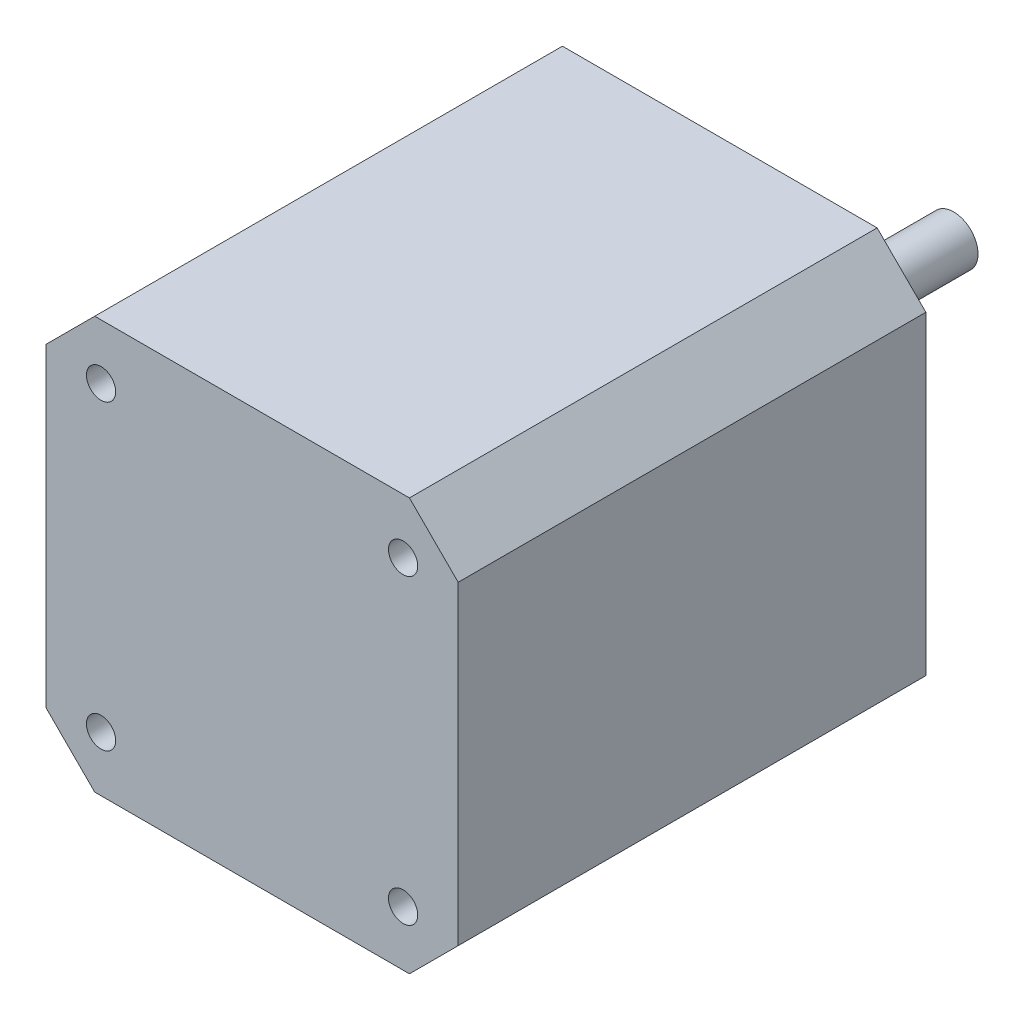
ISO-10303-21;
HEADER;
FILE_DESCRIPTION(('STEP AP214'),'2;1');
FILE_NAME('part.step','',(''),(''),'','','');
FILE_SCHEMA(('AUTOMOTIVE_DESIGN { 1 0 10303 214 1 1 1 1 }'));
ENDSEC;
DATA;
#1=APPLICATION_CONTEXT('core data for automotive mechanical design processes');
#2=APPLICATION_PROTOCOL_DEFINITION('international standard','automotive_design',2000,#1);
#3=PRODUCT_CONTEXT('',#1,'mechanical');
#4=PRODUCT('Part','Part','',(#3));
#5=PRODUCT_RELATED_PRODUCT_CATEGORY('part','',(#4));
#6=PRODUCT_DEFINITION_FORMATION('','',#4);
#7=PRODUCT_DEFINITION_CONTEXT('part definition',#1,'design');
#8=PRODUCT_DEFINITION('design','',#6,#7);
#9=PRODUCT_DEFINITION_SHAPE('','',#8);
#10=(LENGTH_UNIT() NAMED_UNIT(*) SI_UNIT(.MILLI.,.METRE.));
#11=(NAMED_UNIT(*) PLANE_ANGLE_UNIT() SI_UNIT($,.RADIAN.));
#12=(NAMED_UNIT(*) SI_UNIT($,.STERADIAN.) SOLID_ANGLE_UNIT());
#13=UNCERTAINTY_MEASURE_WITH_UNIT(LENGTH_MEASURE(1.E-05),#10,'distance_accuracy_value','');
#14=(GEOMETRIC_REPRESENTATION_CONTEXT(3) GLOBAL_UNCERTAINTY_ASSIGNED_CONTEXT((#13)) GLOBAL_UNIT_ASSIGNED_CONTEXT((#10,
#11,#12)) REPRESENTATION_CONTEXT('',''));
#15=CARTESIAN_POINT('',(0.,0.,0.));
#16=DIRECTION('',(0.,0.,1.));
#17=DIRECTION('',(1.,0.,0.));
#18=AXIS2_PLACEMENT_3D('',#15,#16,#17);
#19=CARTESIAN_POINT('',(0.,0.,-2.));
#20=DIRECTION('',(0.,0.,1.));
#21=DIRECTION('',(1.,0.,0.));
#22=AXIS2_PLACEMENT_3D('',#19,#20,#21);
#23=PLANE('',#22);
#24=CARTESIAN_POINT('',(0.,0.,-2.));
#25=DIRECTION('',(0.,0.,1.));
#26=DIRECTION('',(1.,0.,0.));
#27=AXIS2_PLACEMENT_3D('',#24,#25,#26);
#28=CIRCLE('',#27,11.);
#29=CARTESIAN_POINT('',(11.,0.,-2.));
#30=VERTEX_POINT('',#29);
#31=EDGE_CURVE('E305',#30,#30,#28,.T.);
#32=ORIENTED_EDGE('',*,*,#31,.F.);
#33=EDGE_LOOP('',(#32));
#34=FACE_BOUND('',#33,.T.);
#35=CARTESIAN_POINT('',(0.,0.,-2.));
#36=DIRECTION('',(0.,0.,1.));
#37=DIRECTION('',(1.,0.,0.));
#38=AXIS2_PLACEMENT_3D('',#35,#36,#37);
#39=CIRCLE('',#38,2.5);
#40=CARTESIAN_POINT('',(-1.76776695296637,1.76776695296637,-2.));
#41=VERTEX_POINT('',#40);
#42=CARTESIAN_POINT('',(-1.76776695296637,-1.76776695296637,-2.));
#43=VERTEX_POINT('',#42);
#44=EDGE_CURVE('E150',#41,#43,#39,.F.);
#45=ORIENTED_EDGE('',*,*,#44,.F.);
#46=DIRECTION('',(0.,-1.,0.));
#47=VECTOR('',#46,1.);
#48=CARTESIAN_POINT('',(-1.76776695296637,0.,-2.));
#49=LINE('',#48,#47);
#50=EDGE_CURVE('E12',#41,#43,#49,.T.);
#51=ORIENTED_EDGE('',*,*,#50,.T.);
#52=EDGE_LOOP('',(#45,#51));
#53=FACE_BOUND('',#52,.T.);
#54=ADVANCED_FACE('F142',(#34,#53),#23,.F.);
#55=CARTESIAN_POINT('',(0.,0.,48.));
#56=DIRECTION('',(0.,0.,1.));
#57=DIRECTION('',(1.,0.,0.));
#58=AXIS2_PLACEMENT_3D('',#55,#56,#57);
#59=PLANE('',#58);
#60=CARTESIAN_POINT('',(15.5,15.5,48.));
#61=DIRECTION('',(0.,0.,1.));
#62=DIRECTION('',(1.,0.,0.));
#63=AXIS2_PLACEMENT_3D('',#60,#61,#62);
#64=CIRCLE('',#63,1.5);
#65=CARTESIAN_POINT('',(17.,15.5,48.));
#66=VERTEX_POINT('',#65);
#67=EDGE_CURVE('E317',#66,#66,#64,.T.);
#68=ORIENTED_EDGE('',*,*,#67,.F.);
#69=EDGE_LOOP('',(#68));
#70=FACE_BOUND('',#69,.T.);
#71=CARTESIAN_POINT('',(-15.5,-15.5,48.));
#72=DIRECTION('',(0.,0.,1.));
#73=DIRECTION('',(1.,0.,0.));
#74=AXIS2_PLACEMENT_3D('',#71,#72,#73);
#75=CIRCLE('',#74,1.5);
#76=CARTESIAN_POINT('',(-14.,-15.5,48.));
#77=VERTEX_POINT('',#76);
#78=EDGE_CURVE('E253',#77,#77,#75,.T.);
#79=ORIENTED_EDGE('',*,*,#78,.F.);
#80=EDGE_LOOP('',(#79));
#81=FACE_BOUND('',#80,.T.);
#82=DIRECTION('',(0.707106781186547,-0.707106781186548,0.));
#83=VECTOR('',#82,1.);
#84=CARTESIAN_POINT('',(-21.15,-16.15,48.));
#85=LINE('',#84,#83);
#86=CARTESIAN_POINT('',(-21.15,-16.15,48.));
#87=VERTEX_POINT('',#86);
#88=CARTESIAN_POINT('',(-16.15,-21.15,48.));
#89=VERTEX_POINT('',#88);
#90=EDGE_CURVE('E269',#87,#89,#85,.T.);
#91=ORIENTED_EDGE('',*,*,#90,.T.);
#92=DIRECTION('',(1.,0.,0.));
#93=VECTOR('',#92,1.);
#94=CARTESIAN_POINT('',(-16.15,-21.15,48.));
#95=LINE('',#94,#93);
#96=CARTESIAN_POINT('',(16.15,-21.15,48.));
#97=VERTEX_POINT('',#96);
#98=EDGE_CURVE('E203',#89,#97,#95,.T.);
#99=ORIENTED_EDGE('',*,*,#98,.T.);
#100=DIRECTION('',(0.707106781186548,0.707106781186548,0.));
#101=VECTOR('',#100,1.);
#102=CARTESIAN_POINT('',(16.15,-21.15,48.));
#103=LINE('',#102,#101);
#104=CARTESIAN_POINT('',(21.15,-16.15,48.));
#105=VERTEX_POINT('',#104);
#106=EDGE_CURVE('E335',#97,#105,#103,.T.);
#107=ORIENTED_EDGE('',*,*,#106,.T.);
#108=DIRECTION('',(0.,1.,0.));
#109=VECTOR('',#108,1.);
#110=CARTESIAN_POINT('',(21.15,-16.15,48.));
#111=LINE('',#110,#109);
#112=CARTESIAN_POINT('',(21.15,16.15,48.));
#113=VERTEX_POINT('',#112);
#114=EDGE_CURVE('E337',#105,#113,#111,.T.);
#115=ORIENTED_EDGE('',*,*,#114,.T.);
#116=DIRECTION('',(0.707106781186548,-0.707106781186548,0.));
#117=VECTOR('',#116,1.);
#118=CARTESIAN_POINT('',(16.15,21.15,48.));
#119=LINE('',#118,#117);
#120=CARTESIAN_POINT('',(16.15,21.15,48.));
#121=VERTEX_POINT('',#120);
#122=EDGE_CURVE('E242',#121,#113,#119,.T.);
#123=ORIENTED_EDGE('',*,*,#122,.F.);
#124=DIRECTION('',(1.,0.,0.));
#125=VECTOR('',#124,1.);
#126=CARTESIAN_POINT('',(-16.15,21.15,48.));
#127=LINE('',#126,#125);
#128=CARTESIAN_POINT('',(-16.15,21.15,48.));
#129=VERTEX_POINT('',#128);
#130=EDGE_CURVE('E224',#129,#121,#127,.T.);
#131=ORIENTED_EDGE('',*,*,#130,.F.);
#132=DIRECTION('',(0.707106781186547,0.707106781186548,0.));
#133=VECTOR('',#132,1.);
#134=CARTESIAN_POINT('',(-21.15,16.15,48.));
#135=LINE('',#134,#133);
#136=CARTESIAN_POINT('',(-21.15,16.15,48.));
#137=VERTEX_POINT('',#136);
#138=EDGE_CURVE('E240',#137,#129,#135,.T.);
#139=ORIENTED_EDGE('',*,*,#138,.F.);
#140=DIRECTION('',(0.,1.,0.));
#141=VECTOR('',#140,1.);
#142=CARTESIAN_POINT('',(-21.15,-16.15,48.));
#143=LINE('',#142,#141);
#144=EDGE_CURVE('E245',#87,#137,#143,.T.);
#145=ORIENTED_EDGE('',*,*,#144,.F.);
#146=EDGE_LOOP('',(#91,#99,#107,#115,#123,#131,#139,#145));
#147=FACE_BOUND('',#146,.T.);
#148=CARTESIAN_POINT('',(-15.5,15.5,48.));
#149=DIRECTION('',(0.,0.,1.));
#150=DIRECTION('',(1.,0.,0.));
#151=AXIS2_PLACEMENT_3D('',#148,#149,#150);
#152=CIRCLE('',#151,1.5);
#153=CARTESIAN_POINT('',(-14.,15.5,48.));
#154=VERTEX_POINT('',#153);
#155=EDGE_CURVE('E323',#154,#154,#152,.T.);
#156=ORIENTED_EDGE('',*,*,#155,.F.);
#157=EDGE_LOOP('',(#156));
#158=FACE_BOUND('',#157,.T.);
#159=CARTESIAN_POINT('',(15.5,-15.5,48.));
#160=DIRECTION('',(0.,0.,1.));
#161=DIRECTION('',(1.,0.,0.));
#162=AXIS2_PLACEMENT_3D('',#159,#160,#161);
#163=CIRCLE('',#162,1.5);
#164=CARTESIAN_POINT('',(17.,-15.5,48.));
#165=VERTEX_POINT('',#164);
#166=EDGE_CURVE('E311',#165,#165,#163,.T.);
#167=ORIENTED_EDGE('',*,*,#166,.F.);
#168=EDGE_LOOP('',(#167));
#169=FACE_BOUND('',#168,.T.);
#170=ADVANCED_FACE('F237',(#70,#81,#147,#158,#169),#59,.T.);
#171=CARTESIAN_POINT('',(0.,0.,0.));
#172=DIRECTION('',(0.,0.,1.));
#173=DIRECTION('',(1.,0.,0.));
#174=AXIS2_PLACEMENT_3D('',#171,#172,#173);
#175=PLANE('',#174);
#176=CARTESIAN_POINT('',(0.,0.,0.));
#177=DIRECTION('',(0.,0.,1.));
#178=DIRECTION('',(1.,0.,0.));
#179=AXIS2_PLACEMENT_3D('',#176,#177,#178);
#180=CIRCLE('',#179,11.);
#181=CARTESIAN_POINT('',(11.,0.,0.));
#182=VERTEX_POINT('',#181);
#183=EDGE_CURVE('E300',#182,#182,#180,.T.);
#184=ORIENTED_EDGE('',*,*,#183,.T.);
#185=EDGE_LOOP('',(#184));
#186=FACE_BOUND('',#185,.T.);
#187=DIRECTION('',(0.707106781186547,-0.707106781186548,0.));
#188=VECTOR('',#187,1.);
#189=CARTESIAN_POINT('',(-21.15,-16.15,0.));
#190=LINE('',#189,#188);
#191=CARTESIAN_POINT('',(-21.15,-16.15,0.));
#192=VERTEX_POINT('',#191);
#193=CARTESIAN_POINT('',(-16.15,-21.15,0.));
#194=VERTEX_POINT('',#193);
#195=EDGE_CURVE('E250',#192,#194,#190,.T.);
#196=ORIENTED_EDGE('',*,*,#195,.F.);
#197=DIRECTION('',(0.,1.,0.));
#198=VECTOR('',#197,1.);
#199=CARTESIAN_POINT('',(-21.15,-16.15,0.));
#200=LINE('',#199,#198);
#201=CARTESIAN_POINT('',(-21.15,16.15,0.));
#202=VERTEX_POINT('',#201);
#203=EDGE_CURVE('E266',#192,#202,#200,.T.);
#204=ORIENTED_EDGE('',*,*,#203,.T.);
#205=DIRECTION('',(0.707106781186547,0.707106781186548,0.));
#206=VECTOR('',#205,1.);
#207=CARTESIAN_POINT('',(-21.15,16.15,0.));
#208=LINE('',#207,#206);
#209=CARTESIAN_POINT('',(-16.15,21.15,0.));
#210=VERTEX_POINT('',#209);
#211=EDGE_CURVE('E264',#202,#210,#208,.T.);
#212=ORIENTED_EDGE('',*,*,#211,.T.);
#213=DIRECTION('',(1.,0.,0.));
#214=VECTOR('',#213,1.);
#215=CARTESIAN_POINT('',(-16.15,21.15,0.));
#216=LINE('',#215,#214);
#217=CARTESIAN_POINT('',(16.15,21.15,0.));
#218=VERTEX_POINT('',#217);
#219=EDGE_CURVE('E226',#210,#218,#216,.T.);
#220=ORIENTED_EDGE('',*,*,#219,.T.);
#221=DIRECTION('',(0.707106781186548,-0.707106781186548,0.));
#222=VECTOR('',#221,1.);
#223=CARTESIAN_POINT('',(16.15,21.15,0.));
#224=LINE('',#223,#222);
#225=CARTESIAN_POINT('',(21.15,16.15,0.));
#226=VERTEX_POINT('',#225);
#227=EDGE_CURVE('E260',#218,#226,#224,.T.);
#228=ORIENTED_EDGE('',*,*,#227,.T.);
#229=DIRECTION('',(0.,1.,0.));
#230=VECTOR('',#229,1.);
#231=CARTESIAN_POINT('',(21.15,-16.15,0.));
#232=LINE('',#231,#230);
#233=CARTESIAN_POINT('',(21.15,-16.15,0.));
#234=VERTEX_POINT('',#233);
#235=EDGE_CURVE('E257',#234,#226,#232,.T.);
#236=ORIENTED_EDGE('',*,*,#235,.F.);
#237=DIRECTION('',(0.707106781186548,0.707106781186548,0.));
#238=VECTOR('',#237,1.);
#239=CARTESIAN_POINT('',(16.15,-21.15,0.));
#240=LINE('',#239,#238);
#241=CARTESIAN_POINT('',(16.15,-21.15,0.));
#242=VERTEX_POINT('',#241);
#243=EDGE_CURVE('E255',#242,#234,#240,.T.);
#244=ORIENTED_EDGE('',*,*,#243,.F.);
#245=DIRECTION('',(1.,0.,0.));
#246=VECTOR('',#245,1.);
#247=CARTESIAN_POINT('',(-16.15,-21.15,0.));
#248=LINE('',#247,#246);
#249=EDGE_CURVE('E252',#194,#242,#248,.T.);
#250=ORIENTED_EDGE('',*,*,#249,.F.);
#251=EDGE_LOOP('',(#196,#204,#212,#220,#228,#236,#244,#250));
#252=FACE_BOUND('',#251,.T.);
#253=CARTESIAN_POINT('',(-15.5,-15.5,0.));
#254=DIRECTION('',(0.,0.,1.));
#255=DIRECTION('',(1.,0.,0.));
#256=AXIS2_PLACEMENT_3D('',#253,#254,#255);
#257=CIRCLE('',#256,1.5);
#258=CARTESIAN_POINT('',(-14.,-15.5,0.));
#259=VERTEX_POINT('',#258);
#260=EDGE_CURVE('E326',#259,#259,#257,.T.);
#261=ORIENTED_EDGE('',*,*,#260,.T.);
#262=EDGE_LOOP('',(#261));
#263=FACE_BOUND('',#262,.T.);
#264=CARTESIAN_POINT('',(-15.5,15.5,0.));
#265=DIRECTION('',(0.,0.,1.));
#266=DIRECTION('',(1.,0.,0.));
#267=AXIS2_PLACEMENT_3D('',#264,#265,#266);
#268=CIRCLE('',#267,1.5);
#269=CARTESIAN_POINT('',(-14.,15.5,0.));
#270=VERTEX_POINT('',#269);
#271=EDGE_CURVE('E320',#270,#270,#268,.T.);
#272=ORIENTED_EDGE('',*,*,#271,.T.);
#273=EDGE_LOOP('',(#272));
#274=FACE_BOUND('',#273,.T.);
#275=CARTESIAN_POINT('',(15.5,15.5,0.));
#276=DIRECTION('',(0.,0.,1.));
#277=DIRECTION('',(1.,0.,0.));
#278=AXIS2_PLACEMENT_3D('',#275,#276,#277);
#279=CIRCLE('',#278,1.5);
#280=CARTESIAN_POINT('',(17.,15.5,0.));
#281=VERTEX_POINT('',#280);
#282=EDGE_CURVE('E314',#281,#281,#279,.T.);
#283=ORIENTED_EDGE('',*,*,#282,.T.);
#284=EDGE_LOOP('',(#283));
#285=FACE_BOUND('',#284,.T.);
#286=CARTESIAN_POINT('',(15.5,-15.5,0.));
#287=DIRECTION('',(0.,0.,1.));
#288=DIRECTION('',(1.,0.,0.));
#289=AXIS2_PLACEMENT_3D('',#286,#287,#288);
#290=CIRCLE('',#289,1.5);
#291=CARTESIAN_POINT('',(17.,-15.5,0.));
#292=VERTEX_POINT('',#291);
#293=EDGE_CURVE('E308',#292,#292,#290,.T.);
#294=ORIENTED_EDGE('',*,*,#293,.T.);
#295=EDGE_LOOP('',(#294));
#296=FACE_BOUND('',#295,.T.);
#297=ADVANCED_FACE('F344',(#186,#252,#263,#274,#285,#296),#175,.F.);
#298=CARTESIAN_POINT('',(-21.15,-16.15,48.));
#299=DIRECTION('',(0.707106781186548,0.707106781186547,0.));
#300=DIRECTION('',(-0.707106781186547,0.707106781186548,0.));
#301=AXIS2_PLACEMENT_3D('',#298,#299,#300);
#302=PLANE('',#301);
#303=ORIENTED_EDGE('',*,*,#195,.T.);
#304=DIRECTION('',(0.,0.,-1.));
#305=VECTOR('',#304,1.);
#306=CARTESIAN_POINT('',(-16.15,-21.15,48.));
#307=LINE('',#306,#305);
#308=EDGE_CURVE('E281',#89,#194,#307,.T.);
#309=ORIENTED_EDGE('',*,*,#308,.F.);
#310=ORIENTED_EDGE('',*,*,#90,.F.);
#311=DIRECTION('',(0.,0.,-1.));
#312=VECTOR('',#311,1.);
#313=CARTESIAN_POINT('',(-21.15,-16.15,48.));
#314=LINE('',#313,#312);
#315=EDGE_CURVE('E163',#87,#192,#314,.T.);
#316=ORIENTED_EDGE('',*,*,#315,.T.);
#317=EDGE_LOOP('',(#303,#309,#310,#316));
#318=FACE_BOUND('',#317,.T.);
#319=ADVANCED_FACE('F144',(#318),#302,.F.);
#320=CARTESIAN_POINT('',(-16.15,-21.15,48.));
#321=DIRECTION('',(0.,1.,0.));
#322=DIRECTION('',(0.,0.,1.));
#323=AXIS2_PLACEMENT_3D('',#320,#321,#322);
#324=PLANE('',#323);
#325=ORIENTED_EDGE('',*,*,#249,.T.);
#326=DIRECTION('',(0.,0.,-1.));
#327=VECTOR('',#326,1.);
#328=CARTESIAN_POINT('',(16.15,-21.15,48.));
#329=LINE('',#328,#327);
#330=EDGE_CURVE('E278',#97,#242,#329,.T.);
#331=ORIENTED_EDGE('',*,*,#330,.F.);
#332=ORIENTED_EDGE('',*,*,#98,.F.);
#333=ORIENTED_EDGE('',*,*,#308,.T.);
#334=EDGE_LOOP('',(#325,#331,#332,#333));
#335=FACE_BOUND('',#334,.T.);
#336=ADVANCED_FACE('F348',(#335),#324,.F.);
#337=CARTESIAN_POINT('',(16.15,-21.15,48.));
#338=DIRECTION('',(-0.707106781186547,0.707106781186547,0.));
#339=DIRECTION('',(-0.707106781186548,-0.707106781186548,0.));
#340=AXIS2_PLACEMENT_3D('',#337,#338,#339);
#341=PLANE('',#340);
#342=ORIENTED_EDGE('',*,*,#243,.T.);
#343=DIRECTION('',(0.,0.,-1.));
#344=VECTOR('',#343,1.);
#345=CARTESIAN_POINT('',(21.15,-16.15,48.));
#346=LINE('',#345,#344);
#347=EDGE_CURVE('E275',#105,#234,#346,.T.);
#348=ORIENTED_EDGE('',*,*,#347,.F.);
#349=ORIENTED_EDGE('',*,*,#106,.F.);
#350=ORIENTED_EDGE('',*,*,#330,.T.);
#351=EDGE_LOOP('',(#342,#348,#349,#350));
#352=FACE_BOUND('',#351,.T.);
#353=ADVANCED_FACE('F352',(#352),#341,.F.);
#354=CARTESIAN_POINT('',(21.15,-16.15,48.));
#355=DIRECTION('',(-1.,0.,0.));
#356=DIRECTION('',(0.,0.,1.));
#357=AXIS2_PLACEMENT_3D('',#354,#355,#356);
#358=PLANE('',#357);
#359=ORIENTED_EDGE('',*,*,#235,.T.);
#360=DIRECTION('',(0.,0.,-1.));
#361=VECTOR('',#360,1.);
#362=CARTESIAN_POINT('',(21.15,16.15,48.));
#363=LINE('',#362,#361);
#364=EDGE_CURVE('E273',#113,#226,#363,.T.);
#365=ORIENTED_EDGE('',*,*,#364,.F.);
#366=ORIENTED_EDGE('',*,*,#114,.F.);
#367=ORIENTED_EDGE('',*,*,#347,.T.);
#368=EDGE_LOOP('',(#359,#365,#366,#367));
#369=FACE_BOUND('',#368,.T.);
#370=ADVANCED_FACE('F355',(#369),#358,.F.);
#371=CARTESIAN_POINT('',(16.15,21.15,48.));
#372=DIRECTION('',(0.707106781186547,0.707106781186547,0.));
#373=DIRECTION('',(-0.707106781186548,0.707106781186548,0.));
#374=AXIS2_PLACEMENT_3D('',#371,#372,#373);
#375=PLANE('',#374);
#376=ORIENTED_EDGE('',*,*,#227,.F.);
#377=DIRECTION('',(0.,0.,-1.));
#378=VECTOR('',#377,1.);
#379=CARTESIAN_POINT('',(16.15,21.15,48.));
#380=LINE('',#379,#378);
#381=EDGE_CURVE('E231',#121,#218,#380,.T.);
#382=ORIENTED_EDGE('',*,*,#381,.F.);
#383=ORIENTED_EDGE('',*,*,#122,.T.);
#384=ORIENTED_EDGE('',*,*,#364,.T.);
#385=EDGE_LOOP('',(#376,#382,#383,#384));
#386=FACE_BOUND('',#385,.T.);
#387=ADVANCED_FACE('F340',(#386),#375,.T.);
#388=CARTESIAN_POINT('',(-16.15,21.15,48.));
#389=DIRECTION('',(0.,1.,0.));
#390=DIRECTION('',(0.,0.,1.));
#391=AXIS2_PLACEMENT_3D('',#388,#389,#390);
#392=PLANE('',#391);
#393=ORIENTED_EDGE('',*,*,#219,.F.);
#394=DIRECTION('',(0.,0.,-1.));
#395=VECTOR('',#394,1.);
#396=CARTESIAN_POINT('',(-16.15,21.15,48.));
#397=LINE('',#396,#395);
#398=EDGE_CURVE('E221',#129,#210,#397,.T.);
#399=ORIENTED_EDGE('',*,*,#398,.F.);
#400=ORIENTED_EDGE('',*,*,#130,.T.);
#401=ORIENTED_EDGE('',*,*,#381,.T.);
#402=EDGE_LOOP('',(#393,#399,#400,#401));
#403=FACE_BOUND('',#402,.T.);
#404=ADVANCED_FACE('F223',(#403),#392,.T.);
#405=CARTESIAN_POINT('',(-21.15,16.15,48.));
#406=DIRECTION('',(-0.707106781186548,0.707106781186547,0.));
#407=DIRECTION('',(-0.707106781186547,-0.707106781186548,0.));
#408=AXIS2_PLACEMENT_3D('',#405,#406,#407);
#409=PLANE('',#408);
#410=ORIENTED_EDGE('',*,*,#211,.F.);
#411=DIRECTION('',(0.,0.,-1.));
#412=VECTOR('',#411,1.);
#413=CARTESIAN_POINT('',(-21.15,16.15,48.));
#414=LINE('',#413,#412);
#415=EDGE_CURVE('E232',#137,#202,#414,.T.);
#416=ORIENTED_EDGE('',*,*,#415,.F.);
#417=ORIENTED_EDGE('',*,*,#138,.T.);
#418=ORIENTED_EDGE('',*,*,#398,.T.);
#419=EDGE_LOOP('',(#410,#416,#417,#418));
#420=FACE_BOUND('',#419,.T.);
#421=ADVANCED_FACE('F244',(#420),#409,.T.);
#422=CARTESIAN_POINT('',(-21.15,-16.15,48.));
#423=DIRECTION('',(-1.,0.,0.));
#424=DIRECTION('',(0.,0.,1.));
#425=AXIS2_PLACEMENT_3D('',#422,#423,#424);
#426=PLANE('',#425);
#427=ORIENTED_EDGE('',*,*,#203,.F.);
#428=ORIENTED_EDGE('',*,*,#315,.F.);
#429=ORIENTED_EDGE('',*,*,#144,.T.);
#430=ORIENTED_EDGE('',*,*,#415,.T.);
#431=EDGE_LOOP('',(#427,#428,#429,#430));
#432=FACE_BOUND('',#431,.T.);
#433=ADVANCED_FACE('F346',(#432),#426,.T.);
#434=CARTESIAN_POINT('',(-15.5,-15.5,48.));
#435=DIRECTION('',(0.,0.,-1.));
#436=DIRECTION('',(-1.,0.,0.));
#437=AXIS2_PLACEMENT_3D('',#434,#435,#436);
#438=CYLINDRICAL_SURFACE('',#437,1.5);
#439=ORIENTED_EDGE('',*,*,#78,.T.);
#440=EDGE_LOOP('',(#439));
#441=FACE_BOUND('',#440,.T.);
#442=ORIENTED_EDGE('',*,*,#260,.F.);
#443=EDGE_LOOP('',(#442));
#444=FACE_BOUND('',#443,.T.);
#445=ADVANCED_FACE('F392',(#441,#444),#438,.F.);
#446=CARTESIAN_POINT('',(-15.5,15.5,48.));
#447=DIRECTION('',(0.,0.,-1.));
#448=DIRECTION('',(-1.,0.,0.));
#449=AXIS2_PLACEMENT_3D('',#446,#447,#448);
#450=CYLINDRICAL_SURFACE('',#449,1.5);
#451=ORIENTED_EDGE('',*,*,#155,.T.);
#452=EDGE_LOOP('',(#451));
#453=FACE_BOUND('',#452,.T.);
#454=ORIENTED_EDGE('',*,*,#271,.F.);
#455=EDGE_LOOP('',(#454));
#456=FACE_BOUND('',#455,.T.);
#457=ADVANCED_FACE('F388',(#453,#456),#450,.F.);
#458=CARTESIAN_POINT('',(15.5,15.5,48.));
#459=DIRECTION('',(0.,0.,-1.));
#460=DIRECTION('',(-1.,0.,0.));
#461=AXIS2_PLACEMENT_3D('',#458,#459,#460);
#462=CYLINDRICAL_SURFACE('',#461,1.5);
#463=ORIENTED_EDGE('',*,*,#67,.T.);
#464=EDGE_LOOP('',(#463));
#465=FACE_BOUND('',#464,.T.);
#466=ORIENTED_EDGE('',*,*,#282,.F.);
#467=EDGE_LOOP('',(#466));
#468=FACE_BOUND('',#467,.T.);
#469=ADVANCED_FACE('F384',(#465,#468),#462,.F.);
#470=CARTESIAN_POINT('',(15.5,-15.5,48.));
#471=DIRECTION('',(0.,0.,-1.));
#472=DIRECTION('',(-1.,0.,0.));
#473=AXIS2_PLACEMENT_3D('',#470,#471,#472);
#474=CYLINDRICAL_SURFACE('',#473,1.5);
#475=ORIENTED_EDGE('',*,*,#166,.T.);
#476=EDGE_LOOP('',(#475));
#477=FACE_BOUND('',#476,.T.);
#478=ORIENTED_EDGE('',*,*,#293,.F.);
#479=EDGE_LOOP('',(#478));
#480=FACE_BOUND('',#479,.T.);
#481=ADVANCED_FACE('F380',(#477,#480),#474,.F.);
#482=CARTESIAN_POINT('',(0.,0.,-2.));
#483=DIRECTION('',(0.,0.,1.));
#484=DIRECTION('',(1.,0.,0.));
#485=AXIS2_PLACEMENT_3D('',#482,#483,#484);
#486=CYLINDRICAL_SURFACE('',#485,11.);
#487=ORIENTED_EDGE('',*,*,#31,.T.);
#488=EDGE_LOOP('',(#487));
#489=FACE_BOUND('',#488,.T.);
#490=ORIENTED_EDGE('',*,*,#183,.F.);
#491=EDGE_LOOP('',(#490));
#492=FACE_BOUND('',#491,.T.);
#493=ADVANCED_FACE('F377',(#489,#492),#486,.T.);
#494=CARTESIAN_POINT('',(-1.76776695296637,1.76776695296637,-24.));
#495=DIRECTION('',(-1.,0.,0.));
#496=DIRECTION('',(0.,-1.,0.));
#497=AXIS2_PLACEMENT_3D('',#494,#495,#496);
#498=PLANE('',#497);
#499=ORIENTED_EDGE('',*,*,#50,.F.);
#500=DIRECTION('',(0.,0.,1.));
#501=VECTOR('',#500,1.);
#502=CARTESIAN_POINT('',(-1.76776695296637,1.76776695296637,-24.));
#503=LINE('',#502,#501);
#504=CARTESIAN_POINT('',(-1.76776695296637,1.76776695296637,-24.));
#505=VERTEX_POINT('',#504);
#506=EDGE_CURVE('E292',#505,#41,#503,.T.);
#507=ORIENTED_EDGE('',*,*,#506,.F.);
#508=DIRECTION('',(0.,-1.,0.));
#509=VECTOR('',#508,1.);
#510=CARTESIAN_POINT('',(-1.76776695296637,1.76776695296637,-24.));
#511=LINE('',#510,#509);
#512=CARTESIAN_POINT('',(-1.76776695296637,-1.76776695296637,-24.));
#513=VERTEX_POINT('',#512);
#514=EDGE_CURVE('E297',#505,#513,#511,.T.);
#515=ORIENTED_EDGE('',*,*,#514,.T.);
#516=DIRECTION('',(0.,0.,1.));
#517=VECTOR('',#516,1.);
#518=CARTESIAN_POINT('',(-1.76776695296637,-1.76776695296637,-24.));
#519=LINE('',#518,#517);
#520=EDGE_CURVE('E289',#513,#43,#519,.T.);
#521=ORIENTED_EDGE('',*,*,#520,.T.);
#522=EDGE_LOOP('',(#499,#507,#515,#521));
#523=FACE_BOUND('',#522,.T.);
#524=ADVANCED_FACE('F295',(#523),#498,.T.);
#525=CARTESIAN_POINT('',(0.,0.,-24.));
#526=DIRECTION('',(0.,0.,1.));
#527=DIRECTION('',(1.,0.,0.));
#528=AXIS2_PLACEMENT_3D('',#525,#526,#527);
#529=CYLINDRICAL_SURFACE('',#528,2.5);
#530=ORIENTED_EDGE('',*,*,#506,.T.);
#531=ORIENTED_EDGE('',*,*,#44,.T.);
#532=ORIENTED_EDGE('',*,*,#520,.F.);
#533=CARTESIAN_POINT('',(0.,0.,-24.));
#534=DIRECTION('',(0.,0.,-1.));
#535=DIRECTION('',(-1.,0.,0.));
#536=AXIS2_PLACEMENT_3D('',#533,#534,#535);
#537=CIRCLE('',#536,2.5);
#538=EDGE_CURVE('E298',#505,#513,#537,.T.);
#539=ORIENTED_EDGE('',*,*,#538,.F.);
#540=EDGE_LOOP('',(#530,#531,#532,#539));
#541=FACE_BOUND('',#540,.T.);
#542=ADVANCED_FACE('F286',(#541),#529,.T.);
#543=CARTESIAN_POINT('',(0.,0.,-24.));
#544=DIRECTION('',(0.,0.,-1.));
#545=DIRECTION('',(-1.,0.,0.));
#546=AXIS2_PLACEMENT_3D('',#543,#544,#545);
#547=PLANE('',#546);
#548=ORIENTED_EDGE('',*,*,#514,.F.);
#549=ORIENTED_EDGE('',*,*,#538,.T.);
#550=EDGE_LOOP('',(#548,#549));
#551=FACE_BOUND('',#550,.T.);
#552=ADVANCED_FACE('F449',(#551),#547,.T.);
#553=CLOSED_SHELL('',(#54,#170,#297,#319,#336,#353,#370,#387,#404,#421,#433,#445,#457,#469,#481,
#493,#524,#542,#552));
#554=MANIFOLD_SOLID_BREP('B2',#553);
#555=ADVANCED_BREP_SHAPE_REPRESENTATION('',(#18,#554),#14);
#556=SHAPE_DEFINITION_REPRESENTATION(#9,#555);
ENDSEC;
END-ISO-10303-21;
